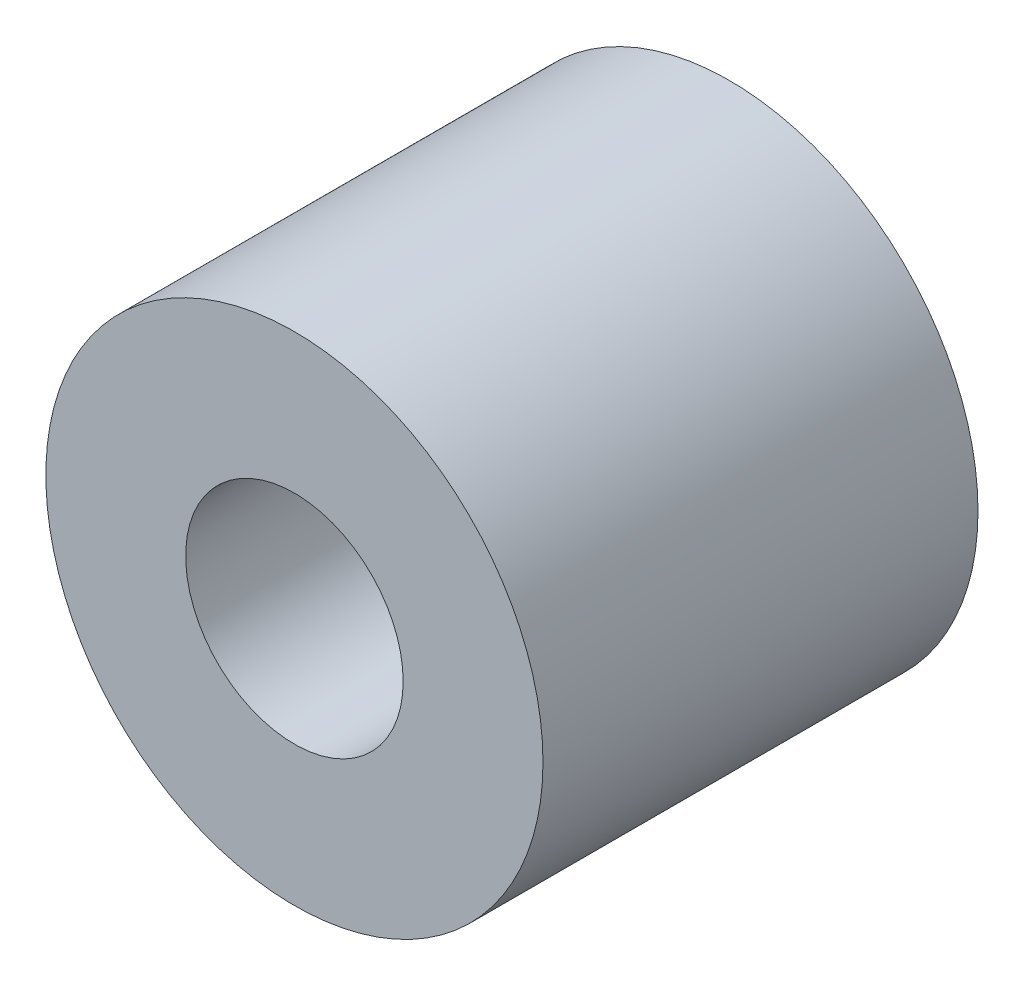
ISO-10303-21;
HEADER;
FILE_DESCRIPTION(('STEP AP214'),'2;1');
FILE_NAME('part.step','',(''),(''),'','','');
FILE_SCHEMA(('AUTOMOTIVE_DESIGN { 1 0 10303 214 1 1 1 1 }'));
ENDSEC;
DATA;
#1=APPLICATION_CONTEXT('core data for automotive mechanical design processes');
#2=APPLICATION_PROTOCOL_DEFINITION('international standard','automotive_design',2000,#1);
#3=PRODUCT_CONTEXT('',#1,'mechanical');
#4=PRODUCT('Part','Part','',(#3));
#5=PRODUCT_RELATED_PRODUCT_CATEGORY('part','',(#4));
#6=PRODUCT_DEFINITION_FORMATION('','',#4);
#7=PRODUCT_DEFINITION_CONTEXT('part definition',#1,'design');
#8=PRODUCT_DEFINITION('design','',#6,#7);
#9=PRODUCT_DEFINITION_SHAPE('','',#8);
#10=(LENGTH_UNIT() NAMED_UNIT(*) SI_UNIT(.MILLI.,.METRE.));
#11=(NAMED_UNIT(*) PLANE_ANGLE_UNIT() SI_UNIT($,.RADIAN.));
#12=(NAMED_UNIT(*) SI_UNIT($,.STERADIAN.) SOLID_ANGLE_UNIT());
#13=UNCERTAINTY_MEASURE_WITH_UNIT(LENGTH_MEASURE(1.E-05),#10,'distance_accuracy_value','');
#14=(GEOMETRIC_REPRESENTATION_CONTEXT(3) GLOBAL_UNCERTAINTY_ASSIGNED_CONTEXT((#13)) GLOBAL_UNIT_ASSIGNED_CONTEXT((#10,
#11,#12)) REPRESENTATION_CONTEXT('',''));
#15=CARTESIAN_POINT('',(0.,0.,0.));
#16=DIRECTION('',(0.,0.,1.));
#17=DIRECTION('',(1.,0.,0.));
#18=AXIS2_PLACEMENT_3D('',#15,#16,#17);
#19=CARTESIAN_POINT('',(0.,0.,3.5));
#20=DIRECTION('',(0.,0.,1.));
#21=DIRECTION('',(1.,0.,0.));
#22=AXIS2_PLACEMENT_3D('',#19,#20,#21);
#23=PLANE('',#22);
#24=CARTESIAN_POINT('',(0.,0.,3.5));
#25=DIRECTION('',(0.,0.,1.));
#26=DIRECTION('',(1.,0.,0.));
#27=AXIS2_PLACEMENT_3D('',#24,#25,#26);
#28=CIRCLE('',#27,4.);
#29=CARTESIAN_POINT('',(4.,0.,3.5));
#30=VERTEX_POINT('',#29);
#31=EDGE_CURVE('E10',#30,#30,#28,.T.);
#32=ORIENTED_EDGE('',*,*,#31,.T.);
#33=EDGE_LOOP('',(#32));
#34=FACE_BOUND('',#33,.T.);
#35=CARTESIAN_POINT('',(0.,0.,3.5));
#36=DIRECTION('',(0.,0.,1.));
#37=DIRECTION('',(1.,0.,0.));
#38=AXIS2_PLACEMENT_3D('',#35,#36,#37);
#39=CIRCLE('',#38,1.75);
#40=CARTESIAN_POINT('',(1.75,0.,3.5));
#41=VERTEX_POINT('',#40);
#42=EDGE_CURVE('E50',#41,#41,#39,.T.);
#43=ORIENTED_EDGE('',*,*,#42,.F.);
#44=EDGE_LOOP('',(#43));
#45=FACE_BOUND('',#44,.T.);
#46=ADVANCED_FACE('F37',(#34,#45),#23,.T.);
#47=CARTESIAN_POINT('',(0.,0.,-3.5));
#48=DIRECTION('',(0.,0.,1.));
#49=DIRECTION('',(1.,0.,0.));
#50=AXIS2_PLACEMENT_3D('',#47,#48,#49);
#51=PLANE('',#50);
#52=CARTESIAN_POINT('',(0.,0.,-3.5));
#53=DIRECTION('',(0.,0.,1.));
#54=DIRECTION('',(1.,0.,0.));
#55=AXIS2_PLACEMENT_3D('',#52,#53,#54);
#56=CIRCLE('',#55,4.);
#57=CARTESIAN_POINT('',(4.,0.,-3.5));
#58=VERTEX_POINT('',#57);
#59=EDGE_CURVE('E41',#58,#58,#56,.T.);
#60=ORIENTED_EDGE('',*,*,#59,.F.);
#61=EDGE_LOOP('',(#60));
#62=FACE_BOUND('',#61,.T.);
#63=CARTESIAN_POINT('',(0.,0.,-3.5));
#64=DIRECTION('',(0.,0.,1.));
#65=DIRECTION('',(1.,0.,0.));
#66=AXIS2_PLACEMENT_3D('',#63,#64,#65);
#67=CIRCLE('',#66,1.75);
#68=CARTESIAN_POINT('',(1.75,0.,-3.5));
#69=VERTEX_POINT('',#68);
#70=EDGE_CURVE('E52',#69,#69,#67,.T.);
#71=ORIENTED_EDGE('',*,*,#70,.T.);
#72=EDGE_LOOP('',(#71));
#73=FACE_BOUND('',#72,.T.);
#74=ADVANCED_FACE('F64',(#62,#73),#51,.F.);
#75=CARTESIAN_POINT('',(0.,0.,3.5));
#76=DIRECTION('',(0.,0.,-1.));
#77=DIRECTION('',(-1.,0.,0.));
#78=AXIS2_PLACEMENT_3D('',#75,#76,#77);
#79=CYLINDRICAL_SURFACE('',#78,4.);
#80=ORIENTED_EDGE('',*,*,#31,.F.);
#81=EDGE_LOOP('',(#80));
#82=FACE_BOUND('',#81,.T.);
#83=ORIENTED_EDGE('',*,*,#59,.T.);
#84=EDGE_LOOP('',(#83));
#85=FACE_BOUND('',#84,.T.);
#86=ADVANCED_FACE('F39',(#82,#85),#79,.T.);
#87=CARTESIAN_POINT('',(0.,0.,3.5));
#88=DIRECTION('',(0.,0.,-1.));
#89=DIRECTION('',(-1.,0.,0.));
#90=AXIS2_PLACEMENT_3D('',#87,#88,#89);
#91=CYLINDRICAL_SURFACE('',#90,1.75);
#92=ORIENTED_EDGE('',*,*,#42,.T.);
#93=EDGE_LOOP('',(#92));
#94=FACE_BOUND('',#93,.T.);
#95=ORIENTED_EDGE('',*,*,#70,.F.);
#96=EDGE_LOOP('',(#95));
#97=FACE_BOUND('',#96,.T.);
#98=ADVANCED_FACE('F60',(#94,#97),#91,.F.);
#99=CLOSED_SHELL('',(#46,#74,#86,#98));
#100=MANIFOLD_SOLID_BREP('B2',#99);
#101=ADVANCED_BREP_SHAPE_REPRESENTATION('',(#18,#100),#14);
#102=SHAPE_DEFINITION_REPRESENTATION(#9,#101);
ENDSEC;
END-ISO-10303-21;
